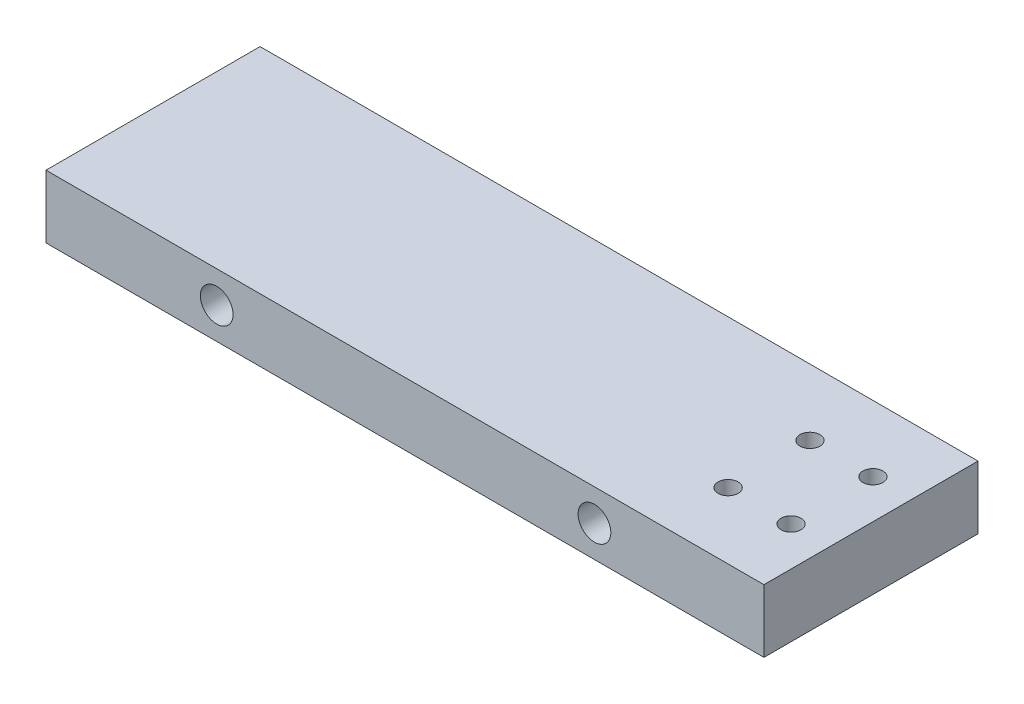
ISO-10303-21;
HEADER;
FILE_DESCRIPTION(('STEP AP214'),'2;1');
FILE_NAME('part.step','',(''),(''),'','','');
FILE_SCHEMA(('AUTOMOTIVE_DESIGN { 1 0 10303 214 1 1 1 1 }'));
ENDSEC;
DATA;
#1=APPLICATION_CONTEXT('core data for automotive mechanical design processes');
#2=APPLICATION_PROTOCOL_DEFINITION('international standard','automotive_design',2000,#1);
#3=PRODUCT_CONTEXT('',#1,'mechanical');
#4=PRODUCT('Part','Part','',(#3));
#5=PRODUCT_RELATED_PRODUCT_CATEGORY('part','',(#4));
#6=PRODUCT_DEFINITION_FORMATION('','',#4);
#7=PRODUCT_DEFINITION_CONTEXT('part definition',#1,'design');
#8=PRODUCT_DEFINITION('design','',#6,#7);
#9=PRODUCT_DEFINITION_SHAPE('','',#8);
#10=(LENGTH_UNIT() NAMED_UNIT(*) SI_UNIT(.MILLI.,.METRE.));
#11=(NAMED_UNIT(*) PLANE_ANGLE_UNIT() SI_UNIT($,.RADIAN.));
#12=(NAMED_UNIT(*) SI_UNIT($,.STERADIAN.) SOLID_ANGLE_UNIT());
#13=UNCERTAINTY_MEASURE_WITH_UNIT(LENGTH_MEASURE(1.E-05),#10,'distance_accuracy_value','');
#14=(GEOMETRIC_REPRESENTATION_CONTEXT(3) GLOBAL_UNCERTAINTY_ASSIGNED_CONTEXT((#13)) GLOBAL_UNIT_ASSIGNED_CONTEXT((#10,
#11,#12)) REPRESENTATION_CONTEXT('',''));
#15=CARTESIAN_POINT('',(0.,0.,0.));
#16=DIRECTION('',(0.,0.,1.));
#17=DIRECTION('',(1.,0.,0.));
#18=AXIS2_PLACEMENT_3D('',#15,#16,#17);
#19=CARTESIAN_POINT('',(0.,10.01,0.));
#20=DIRECTION('',(0.,0.,-1.));
#21=DIRECTION('',(-1.,0.,0.));
#22=AXIS2_PLACEMENT_3D('',#19,#20,#21);
#23=PLANE('',#22);
#24=CARTESIAN_POINT('',(29.8,5.,0.));
#25=DIRECTION('',(0.,0.,-1.));
#26=DIRECTION('',(-1.,0.,0.));
#27=AXIS2_PLACEMENT_3D('',#24,#25,#26);
#28=CIRCLE('',#27,2.6);
#29=CARTESIAN_POINT('',(27.2,5.,0.));
#30=VERTEX_POINT('',#29);
#31=EDGE_CURVE('E119',#30,#30,#28,.T.);
#32=ORIENTED_EDGE('',*,*,#31,.T.);
#33=EDGE_LOOP('',(#32));
#34=FACE_BOUND('',#33,.T.);
#35=CARTESIAN_POINT('',(89.8,5.,0.));
#36=DIRECTION('',(0.,0.,-1.));
#37=DIRECTION('',(-1.,0.,0.));
#38=AXIS2_PLACEMENT_3D('',#35,#36,#37);
#39=CIRCLE('',#38,2.6);
#40=CARTESIAN_POINT('',(87.2,5.,0.));
#41=VERTEX_POINT('',#40);
#42=EDGE_CURVE('E106',#41,#41,#39,.T.);
#43=ORIENTED_EDGE('',*,*,#42,.T.);
#44=EDGE_LOOP('',(#43));
#45=FACE_BOUND('',#44,.T.);
#46=DIRECTION('',(0.,1.,0.));
#47=VECTOR('',#46,1.);
#48=CARTESIAN_POINT('',(2.69,10.01,0.));
#49=LINE('',#48,#47);
#50=CARTESIAN_POINT('',(2.69,0.,0.));
#51=VERTEX_POINT('',#50);
#52=CARTESIAN_POINT('',(2.69,10.01,0.));
#53=VERTEX_POINT('',#52);
#54=EDGE_CURVE('E88',#51,#53,#49,.T.);
#55=ORIENTED_EDGE('',*,*,#54,.F.);
#56=DIRECTION('',(1.,0.,0.));
#57=VECTOR('',#56,1.);
#58=CARTESIAN_POINT('',(0.,0.,0.));
#59=LINE('',#58,#57);
#60=CARTESIAN_POINT('',(116.71881,0.,0.));
#61=VERTEX_POINT('',#60);
#62=EDGE_CURVE('E96',#51,#61,#59,.T.);
#63=ORIENTED_EDGE('',*,*,#62,.T.);
#64=DIRECTION('',(0.,-1.,0.));
#65=VECTOR('',#64,1.);
#66=CARTESIAN_POINT('',(116.71881,10.01,0.));
#67=LINE('',#66,#65);
#68=CARTESIAN_POINT('',(116.71881,10.01,0.));
#69=VERTEX_POINT('',#68);
#70=EDGE_CURVE('E167',#69,#61,#67,.T.);
#71=ORIENTED_EDGE('',*,*,#70,.F.);
#72=DIRECTION('',(1.,0.,0.));
#73=VECTOR('',#72,1.);
#74=CARTESIAN_POINT('',(0.,10.01,0.));
#75=LINE('',#74,#73);
#76=EDGE_CURVE('E53',#53,#69,#75,.T.);
#77=ORIENTED_EDGE('',*,*,#76,.F.);
#78=EDGE_LOOP('',(#55,#63,#71,#77));
#79=FACE_BOUND('',#78,.T.);
#80=ADVANCED_FACE('F44',(#34,#45,#79),#23,.F.);
#81=CARTESIAN_POINT('',(0.,10.01,-34.));
#82=DIRECTION('',(0.,0.,1.));
#83=DIRECTION('',(1.,0.,0.));
#84=AXIS2_PLACEMENT_3D('',#81,#82,#83);
#85=PLANE('',#84);
#86=CARTESIAN_POINT('',(29.8,5.,-34.));
#87=DIRECTION('',(0.,0.,-1.));
#88=DIRECTION('',(-1.,0.,0.));
#89=AXIS2_PLACEMENT_3D('',#86,#87,#88);
#90=CIRCLE('',#89,2.6);
#91=CARTESIAN_POINT('',(27.2,5.,-34.));
#92=VERTEX_POINT('',#91);
#93=EDGE_CURVE('E115',#92,#92,#90,.T.);
#94=ORIENTED_EDGE('',*,*,#93,.F.);
#95=EDGE_LOOP('',(#94));
#96=FACE_BOUND('',#95,.T.);
#97=CARTESIAN_POINT('',(89.8,5.,-34.));
#98=DIRECTION('',(0.,0.,-1.));
#99=DIRECTION('',(-1.,0.,0.));
#100=AXIS2_PLACEMENT_3D('',#97,#98,#99);
#101=CIRCLE('',#100,2.6);
#102=CARTESIAN_POINT('',(87.2,5.,-34.));
#103=VERTEX_POINT('',#102);
#104=EDGE_CURVE('E110',#103,#103,#101,.T.);
#105=ORIENTED_EDGE('',*,*,#104,.F.);
#106=EDGE_LOOP('',(#105));
#107=FACE_BOUND('',#106,.T.);
#108=DIRECTION('',(0.,-1.,0.));
#109=VECTOR('',#108,1.);
#110=CARTESIAN_POINT('',(2.69,10.01,-34.));
#111=LINE('',#110,#109);
#112=CARTESIAN_POINT('',(2.69,10.01,-34.));
#113=VERTEX_POINT('',#112);
#114=CARTESIAN_POINT('',(2.69,0.,-34.));
#115=VERTEX_POINT('',#114);
#116=EDGE_CURVE('E61',#113,#115,#111,.T.);
#117=ORIENTED_EDGE('',*,*,#116,.F.);
#118=DIRECTION('',(-1.,0.,0.));
#119=VECTOR('',#118,1.);
#120=CARTESIAN_POINT('',(0.,10.01,-34.));
#121=LINE('',#120,#119);
#122=CARTESIAN_POINT('',(116.71881,10.01,-34.));
#123=VERTEX_POINT('',#122);
#124=EDGE_CURVE('E11',#123,#113,#121,.T.);
#125=ORIENTED_EDGE('',*,*,#124,.F.);
#126=DIRECTION('',(0.,1.,0.));
#127=VECTOR('',#126,1.);
#128=CARTESIAN_POINT('',(116.71881,10.01,-34.));
#129=LINE('',#128,#127);
#130=CARTESIAN_POINT('',(116.71881,0.,-34.));
#131=VERTEX_POINT('',#130);
#132=EDGE_CURVE('E161',#131,#123,#129,.T.);
#133=ORIENTED_EDGE('',*,*,#132,.F.);
#134=DIRECTION('',(-1.,0.,0.));
#135=VECTOR('',#134,1.);
#136=CARTESIAN_POINT('',(0.,0.,-34.));
#137=LINE('',#136,#135);
#138=EDGE_CURVE('E47',#131,#115,#137,.T.);
#139=ORIENTED_EDGE('',*,*,#138,.T.);
#140=EDGE_LOOP('',(#117,#125,#133,#139));
#141=FACE_BOUND('',#140,.T.);
#142=ADVANCED_FACE('F174',(#96,#107,#141),#85,.F.);
#143=CARTESIAN_POINT('',(0.,10.01,0.));
#144=DIRECTION('',(0.,-1.,0.));
#145=DIRECTION('',(0.,0.,-1.));
#146=AXIS2_PLACEMENT_3D('',#143,#144,#145);
#147=PLANE('',#146);
#148=CARTESIAN_POINT('',(110.52881,10.01,-10.5));
#149=DIRECTION('',(0.,1.,0.));
#150=DIRECTION('',(0.,0.,1.));
#151=AXIS2_PLACEMENT_3D('',#148,#149,#150);
#152=CIRCLE('',#151,1.58999999999999);
#153=CARTESIAN_POINT('',(110.52881,10.01,-8.91000000000001));
#154=VERTEX_POINT('',#153);
#155=EDGE_CURVE('E127',#154,#154,#152,.T.);
#156=ORIENTED_EDGE('',*,*,#155,.F.);
#157=EDGE_LOOP('',(#156));
#158=FACE_BOUND('',#157,.T.);
#159=CARTESIAN_POINT('',(100.52881,10.01,-23.5));
#160=DIRECTION('',(0.,1.,0.));
#161=DIRECTION('',(0.,0.,1.));
#162=AXIS2_PLACEMENT_3D('',#159,#160,#161);
#163=CIRCLE('',#162,1.58999999999999);
#164=CARTESIAN_POINT('',(100.52881,10.01,-21.91));
#165=VERTEX_POINT('',#164);
#166=EDGE_CURVE('E140',#165,#165,#163,.T.);
#167=ORIENTED_EDGE('',*,*,#166,.F.);
#168=EDGE_LOOP('',(#167));
#169=FACE_BOUND('',#168,.T.);
#170=CARTESIAN_POINT('',(100.52881,10.01,-10.5));
#171=DIRECTION('',(0.,1.,0.));
#172=DIRECTION('',(0.,0.,1.));
#173=AXIS2_PLACEMENT_3D('',#170,#171,#172);
#174=CIRCLE('',#173,1.58999999999999);
#175=CARTESIAN_POINT('',(100.52881,10.01,-8.91));
#176=VERTEX_POINT('',#175);
#177=EDGE_CURVE('E139',#176,#176,#174,.T.);
#178=ORIENTED_EDGE('',*,*,#177,.F.);
#179=EDGE_LOOP('',(#178));
#180=FACE_BOUND('',#179,.T.);
#181=CARTESIAN_POINT('',(110.52881,10.01,-23.5));
#182=DIRECTION('',(0.,1.,0.));
#183=DIRECTION('',(0.,0.,1.));
#184=AXIS2_PLACEMENT_3D('',#181,#182,#183);
#185=CIRCLE('',#184,1.58999999999999);
#186=CARTESIAN_POINT('',(110.52881,10.01,-21.91));
#187=VERTEX_POINT('',#186);
#188=EDGE_CURVE('E131',#187,#187,#185,.T.);
#189=ORIENTED_EDGE('',*,*,#188,.F.);
#190=EDGE_LOOP('',(#189));
#191=FACE_BOUND('',#190,.T.);
#192=DIRECTION('',(0.,0.,-1.));
#193=VECTOR('',#192,1.);
#194=CARTESIAN_POINT('',(2.69,10.01,-34.));
#195=LINE('',#194,#193);
#196=EDGE_CURVE('E99',#53,#113,#195,.T.);
#197=ORIENTED_EDGE('',*,*,#196,.F.);
#198=ORIENTED_EDGE('',*,*,#76,.T.);
#199=DIRECTION('',(0.,0.,1.));
#200=VECTOR('',#199,1.);
#201=CARTESIAN_POINT('',(116.71881,10.01,0.));
#202=LINE('',#201,#200);
#203=EDGE_CURVE('E155',#123,#69,#202,.T.);
#204=ORIENTED_EDGE('',*,*,#203,.F.);
#205=ORIENTED_EDGE('',*,*,#124,.T.);
#206=EDGE_LOOP('',(#197,#198,#204,#205));
#207=FACE_BOUND('',#206,.T.);
#208=ADVANCED_FACE('F176',(#158,#169,#180,#191,#207),#147,.F.);
#209=CARTESIAN_POINT('',(0.,0.,0.));
#210=DIRECTION('',(0.,-1.,0.));
#211=DIRECTION('',(0.,0.,-1.));
#212=AXIS2_PLACEMENT_3D('',#209,#210,#211);
#213=PLANE('',#212);
#214=CARTESIAN_POINT('',(110.52881,0.,-23.5));
#215=DIRECTION('',(0.,1.,0.));
#216=DIRECTION('',(0.,0.,1.));
#217=AXIS2_PLACEMENT_3D('',#214,#215,#216);
#218=CIRCLE('',#217,1.58999999999999);
#219=CARTESIAN_POINT('',(110.52881,0.,-21.91));
#220=VERTEX_POINT('',#219);
#221=EDGE_CURVE('E144',#220,#220,#218,.T.);
#222=ORIENTED_EDGE('',*,*,#221,.T.);
#223=EDGE_LOOP('',(#222));
#224=FACE_BOUND('',#223,.T.);
#225=CARTESIAN_POINT('',(100.52881,0.,-10.5));
#226=DIRECTION('',(0.,1.,0.));
#227=DIRECTION('',(0.,0.,1.));
#228=AXIS2_PLACEMENT_3D('',#225,#226,#227);
#229=CIRCLE('',#228,1.58999999999999);
#230=CARTESIAN_POINT('',(100.52881,0.,-8.91));
#231=VERTEX_POINT('',#230);
#232=EDGE_CURVE('E135',#231,#231,#229,.T.);
#233=ORIENTED_EDGE('',*,*,#232,.T.);
#234=EDGE_LOOP('',(#233));
#235=FACE_BOUND('',#234,.T.);
#236=CARTESIAN_POINT('',(100.52881,0.,-23.5));
#237=DIRECTION('',(0.,1.,0.));
#238=DIRECTION('',(0.,0.,1.));
#239=AXIS2_PLACEMENT_3D('',#236,#237,#238);
#240=CIRCLE('',#239,1.58999999999999);
#241=CARTESIAN_POINT('',(100.52881,0.,-21.91));
#242=VERTEX_POINT('',#241);
#243=EDGE_CURVE('E151',#242,#242,#240,.T.);
#244=ORIENTED_EDGE('',*,*,#243,.T.);
#245=EDGE_LOOP('',(#244));
#246=FACE_BOUND('',#245,.T.);
#247=CARTESIAN_POINT('',(110.52881,0.,-10.5));
#248=DIRECTION('',(0.,1.,0.));
#249=DIRECTION('',(0.,0.,1.));
#250=AXIS2_PLACEMENT_3D('',#247,#248,#249);
#251=CIRCLE('',#250,1.58999999999999);
#252=CARTESIAN_POINT('',(110.52881,0.,-8.91000000000001));
#253=VERTEX_POINT('',#252);
#254=EDGE_CURVE('E120',#253,#253,#251,.T.);
#255=ORIENTED_EDGE('',*,*,#254,.T.);
#256=EDGE_LOOP('',(#255));
#257=FACE_BOUND('',#256,.T.);
#258=ORIENTED_EDGE('',*,*,#62,.F.);
#259=DIRECTION('',(0.,0.,1.));
#260=VECTOR('',#259,1.);
#261=CARTESIAN_POINT('',(2.69,0.,-34.));
#262=LINE('',#261,#260);
#263=EDGE_CURVE('E85',#115,#51,#262,.T.);
#264=ORIENTED_EDGE('',*,*,#263,.F.);
#265=ORIENTED_EDGE('',*,*,#138,.F.);
#266=DIRECTION('',(0.,0.,-1.));
#267=VECTOR('',#266,1.);
#268=CARTESIAN_POINT('',(116.71881,0.,0.));
#269=LINE('',#268,#267);
#270=EDGE_CURVE('E103',#61,#131,#269,.T.);
#271=ORIENTED_EDGE('',*,*,#270,.F.);
#272=EDGE_LOOP('',(#258,#264,#265,#271));
#273=FACE_BOUND('',#272,.T.);
#274=ADVANCED_FACE('F101',(#224,#235,#246,#257,#273),#213,.T.);
#275=CARTESIAN_POINT('',(29.8,5.,0.));
#276=DIRECTION('',(0.,0.,-1.));
#277=DIRECTION('',(-1.,0.,0.));
#278=AXIS2_PLACEMENT_3D('',#275,#276,#277);
#279=CYLINDRICAL_SURFACE('',#278,2.6);
#280=ORIENTED_EDGE('',*,*,#31,.F.);
#281=EDGE_LOOP('',(#280));
#282=FACE_BOUND('',#281,.T.);
#283=ORIENTED_EDGE('',*,*,#93,.T.);
#284=EDGE_LOOP('',(#283));
#285=FACE_BOUND('',#284,.T.);
#286=ADVANCED_FACE('F205',(#282,#285),#279,.F.);
#287=CARTESIAN_POINT('',(89.8,5.,0.));
#288=DIRECTION('',(0.,0.,-1.));
#289=DIRECTION('',(-1.,0.,0.));
#290=AXIS2_PLACEMENT_3D('',#287,#288,#289);
#291=CYLINDRICAL_SURFACE('',#290,2.6);
#292=ORIENTED_EDGE('',*,*,#42,.F.);
#293=EDGE_LOOP('',(#292));
#294=FACE_BOUND('',#293,.T.);
#295=ORIENTED_EDGE('',*,*,#104,.T.);
#296=EDGE_LOOP('',(#295));
#297=FACE_BOUND('',#296,.T.);
#298=ADVANCED_FACE('F201',(#294,#297),#291,.F.);
#299=CARTESIAN_POINT('',(110.52881,0.,-10.5));
#300=DIRECTION('',(0.,1.,0.));
#301=DIRECTION('',(0.,0.,1.));
#302=AXIS2_PLACEMENT_3D('',#299,#300,#301);
#303=CYLINDRICAL_SURFACE('',#302,1.58999999999999);
#304=ORIENTED_EDGE('',*,*,#254,.F.);
#305=EDGE_LOOP('',(#304));
#306=FACE_BOUND('',#305,.T.);
#307=ORIENTED_EDGE('',*,*,#155,.T.);
#308=EDGE_LOOP('',(#307));
#309=FACE_BOUND('',#308,.T.);
#310=ADVANCED_FACE('F204',(#306,#309),#303,.F.);
#311=CARTESIAN_POINT('',(100.52881,0.,-23.5));
#312=DIRECTION('',(0.,1.,0.));
#313=DIRECTION('',(0.,0.,1.));
#314=AXIS2_PLACEMENT_3D('',#311,#312,#313);
#315=CYLINDRICAL_SURFACE('',#314,1.58999999999999);
#316=ORIENTED_EDGE('',*,*,#243,.F.);
#317=EDGE_LOOP('',(#316));
#318=FACE_BOUND('',#317,.T.);
#319=ORIENTED_EDGE('',*,*,#166,.T.);
#320=EDGE_LOOP('',(#319));
#321=FACE_BOUND('',#320,.T.);
#322=ADVANCED_FACE('F213',(#318,#321),#315,.F.);
#323=CARTESIAN_POINT('',(100.52881,0.,-10.5));
#324=DIRECTION('',(0.,1.,0.));
#325=DIRECTION('',(0.,0.,1.));
#326=AXIS2_PLACEMENT_3D('',#323,#324,#325);
#327=CYLINDRICAL_SURFACE('',#326,1.58999999999999);
#328=ORIENTED_EDGE('',*,*,#232,.F.);
#329=EDGE_LOOP('',(#328));
#330=FACE_BOUND('',#329,.T.);
#331=ORIENTED_EDGE('',*,*,#177,.T.);
#332=EDGE_LOOP('',(#331));
#333=FACE_BOUND('',#332,.T.);
#334=ADVANCED_FACE('F187',(#330,#333),#327,.F.);
#335=CARTESIAN_POINT('',(110.52881,0.,-23.5));
#336=DIRECTION('',(0.,1.,0.));
#337=DIRECTION('',(0.,0.,1.));
#338=AXIS2_PLACEMENT_3D('',#335,#336,#337);
#339=CYLINDRICAL_SURFACE('',#338,1.58999999999999);
#340=ORIENTED_EDGE('',*,*,#221,.F.);
#341=EDGE_LOOP('',(#340));
#342=FACE_BOUND('',#341,.T.);
#343=ORIENTED_EDGE('',*,*,#188,.T.);
#344=EDGE_LOOP('',(#343));
#345=FACE_BOUND('',#344,.T.);
#346=ADVANCED_FACE('F180',(#342,#345),#339,.F.);
#347=CARTESIAN_POINT('',(116.71881,0.,0.));
#348=DIRECTION('',(1.,0.,0.));
#349=DIRECTION('',(0.,0.,-1.));
#350=AXIS2_PLACEMENT_3D('',#347,#348,#349);
#351=PLANE('',#350);
#352=ORIENTED_EDGE('',*,*,#70,.T.);
#353=ORIENTED_EDGE('',*,*,#270,.T.);
#354=ORIENTED_EDGE('',*,*,#132,.T.);
#355=ORIENTED_EDGE('',*,*,#203,.T.);
#356=EDGE_LOOP('',(#352,#353,#354,#355));
#357=FACE_BOUND('',#356,.T.);
#358=ADVANCED_FACE('F178',(#357),#351,.T.);
#359=CARTESIAN_POINT('',(2.69,0.,0.));
#360=DIRECTION('',(-1.,0.,0.));
#361=DIRECTION('',(0.,0.,1.));
#362=AXIS2_PLACEMENT_3D('',#359,#360,#361);
#363=PLANE('',#362);
#364=ORIENTED_EDGE('',*,*,#116,.T.);
#365=ORIENTED_EDGE('',*,*,#263,.T.);
#366=ORIENTED_EDGE('',*,*,#54,.T.);
#367=ORIENTED_EDGE('',*,*,#196,.T.);
#368=EDGE_LOOP('',(#364,#365,#366,#367));
#369=FACE_BOUND('',#368,.T.);
#370=ADVANCED_FACE('F87',(#369),#363,.T.);
#371=CLOSED_SHELL('',(#80,#142,#208,#274,#286,#298,#310,#322,#334,#346,#358,#370));
#372=MANIFOLD_SOLID_BREP('B2',#371);
#373=ADVANCED_BREP_SHAPE_REPRESENTATION('',(#18,#372),#14);
#374=SHAPE_DEFINITION_REPRESENTATION(#9,#373);
ENDSEC;
END-ISO-10303-21;
